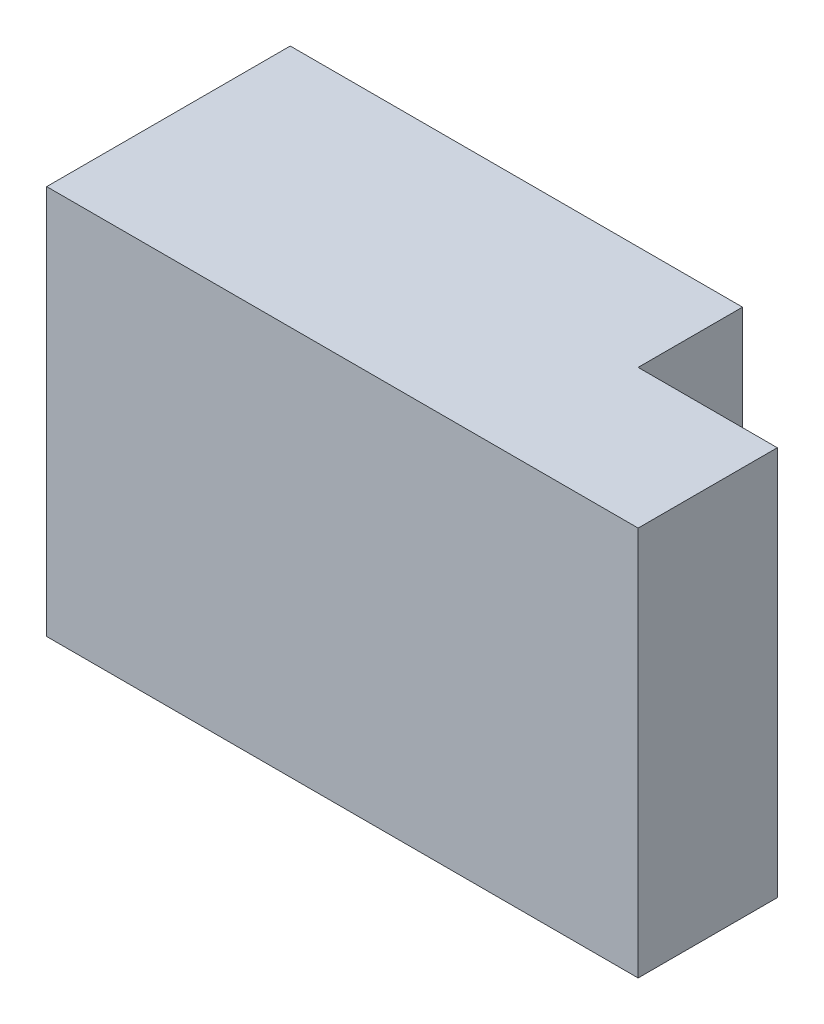
ISO-10303-21;
HEADER;
FILE_DESCRIPTION(('STEP AP214'),'2;1');
FILE_NAME('part.step','',(''),(''),'','','');
FILE_SCHEMA(('AUTOMOTIVE_DESIGN { 1 0 10303 214 1 1 1 1 }'));
ENDSEC;
DATA;
#1=APPLICATION_CONTEXT('core data for automotive mechanical design processes');
#2=APPLICATION_PROTOCOL_DEFINITION('international standard','automotive_design',2000,#1);
#3=PRODUCT_CONTEXT('',#1,'mechanical');
#4=PRODUCT('Part','Part','',(#3));
#5=PRODUCT_RELATED_PRODUCT_CATEGORY('part','',(#4));
#6=PRODUCT_DEFINITION_FORMATION('','',#4);
#7=PRODUCT_DEFINITION_CONTEXT('part definition',#1,'design');
#8=PRODUCT_DEFINITION('design','',#6,#7);
#9=PRODUCT_DEFINITION_SHAPE('','',#8);
#10=(LENGTH_UNIT() NAMED_UNIT(*) SI_UNIT(.MILLI.,.METRE.));
#11=(NAMED_UNIT(*) PLANE_ANGLE_UNIT() SI_UNIT($,.RADIAN.));
#12=(NAMED_UNIT(*) SI_UNIT($,.STERADIAN.) SOLID_ANGLE_UNIT());
#13=UNCERTAINTY_MEASURE_WITH_UNIT(LENGTH_MEASURE(1.E-05),#10,'distance_accuracy_value','');
#14=(GEOMETRIC_REPRESENTATION_CONTEXT(3) GLOBAL_UNCERTAINTY_ASSIGNED_CONTEXT((#13)) GLOBAL_UNIT_ASSIGNED_CONTEXT((#10,
#11,#12)) REPRESENTATION_CONTEXT('',''));
#15=CARTESIAN_POINT('',(0.,0.,0.));
#16=DIRECTION('',(0.,0.,1.));
#17=DIRECTION('',(1.,0.,0.));
#18=AXIS2_PLACEMENT_3D('',#15,#16,#17);
#19=CARTESIAN_POINT('',(0.,0.,0.));
#20=DIRECTION('',(0.,0.,1.));
#21=DIRECTION('',(1.,0.,0.));
#22=AXIS2_PLACEMENT_3D('',#19,#20,#21);
#23=PLANE('',#22);
#24=DIRECTION('',(0.,-1.,0.));
#25=VECTOR('',#24,1.);
#26=CARTESIAN_POINT('',(-32.5,-28.,0.));
#27=LINE('',#26,#25);
#28=CARTESIAN_POINT('',(-32.5,28.,0.));
#29=VERTEX_POINT('',#28);
#30=CARTESIAN_POINT('',(-32.5,-28.,0.));
#31=VERTEX_POINT('',#30);
#32=EDGE_CURVE('E100',#29,#31,#27,.T.);
#33=ORIENTED_EDGE('',*,*,#32,.F.);
#34=DIRECTION('',(-1.,0.,0.));
#35=VECTOR('',#34,1.);
#36=CARTESIAN_POINT('',(32.5,28.,0.));
#37=LINE('',#36,#35);
#38=CARTESIAN_POINT('',(32.5,28.,0.));
#39=VERTEX_POINT('',#38);
#40=EDGE_CURVE('E83',#39,#29,#37,.T.);
#41=ORIENTED_EDGE('',*,*,#40,.F.);
#42=DIRECTION('',(0.,1.,0.));
#43=VECTOR('',#42,1.);
#44=CARTESIAN_POINT('',(32.5,-28.,0.));
#45=LINE('',#44,#43);
#46=CARTESIAN_POINT('',(32.5,-28.,0.));
#47=VERTEX_POINT('',#46);
#48=EDGE_CURVE('E75',#47,#39,#45,.T.);
#49=ORIENTED_EDGE('',*,*,#48,.F.);
#50=DIRECTION('',(1.,0.,0.));
#51=VECTOR('',#50,1.);
#52=CARTESIAN_POINT('',(32.5,-28.,0.));
#53=LINE('',#52,#51);
#54=EDGE_CURVE('E84',#31,#47,#53,.T.);
#55=ORIENTED_EDGE('',*,*,#54,.F.);
#56=EDGE_LOOP('',(#33,#41,#49,#55));
#57=FACE_BOUND('',#56,.T.);
#58=CARTESIAN_POINT('',(-29.,24.5,0.));
#59=DIRECTION('',(0.,0.,1.));
#60=DIRECTION('',(1.,0.,0.));
#61=AXIS2_PLACEMENT_3D('',#58,#59,#60);
#62=CIRCLE('',#61,1.35000000000001);
#63=CARTESIAN_POINT('',(-27.65,24.5,0.));
#64=VERTEX_POINT('',#63);
#65=EDGE_CURVE('E177',#64,#64,#62,.T.);
#66=ORIENTED_EDGE('',*,*,#65,.T.);
#67=EDGE_LOOP('',(#66));
#68=FACE_BOUND('',#67,.T.);
#69=CARTESIAN_POINT('',(29.,24.5,0.));
#70=DIRECTION('',(0.,0.,1.));
#71=DIRECTION('',(-1.,0.,0.));
#72=AXIS2_PLACEMENT_3D('',#69,#70,#71);
#73=CIRCLE('',#72,1.35000000000001);
#74=CARTESIAN_POINT('',(27.65,24.5,0.));
#75=VERTEX_POINT('',#74);
#76=EDGE_CURVE('E170',#75,#75,#73,.T.);
#77=ORIENTED_EDGE('',*,*,#76,.T.);
#78=EDGE_LOOP('',(#77));
#79=FACE_BOUND('',#78,.T.);
#80=CARTESIAN_POINT('',(-29.,-24.5,0.));
#81=DIRECTION('',(0.,0.,1.));
#82=DIRECTION('',(-1.,0.,0.));
#83=AXIS2_PLACEMENT_3D('',#80,#81,#82);
#84=CIRCLE('',#83,1.35000000000001);
#85=CARTESIAN_POINT('',(-30.35,-24.5,0.));
#86=VERTEX_POINT('',#85);
#87=EDGE_CURVE('E161',#86,#86,#84,.T.);
#88=ORIENTED_EDGE('',*,*,#87,.T.);
#89=EDGE_LOOP('',(#88));
#90=FACE_BOUND('',#89,.T.);
#91=CARTESIAN_POINT('',(29.,-24.5,0.));
#92=DIRECTION('',(0.,0.,1.));
#93=DIRECTION('',(1.,0.,0.));
#94=AXIS2_PLACEMENT_3D('',#91,#92,#93);
#95=CIRCLE('',#94,1.35000000000001);
#96=CARTESIAN_POINT('',(30.35,-24.5,0.));
#97=VERTEX_POINT('',#96);
#98=EDGE_CURVE('E157',#97,#97,#95,.T.);
#99=ORIENTED_EDGE('',*,*,#98,.T.);
#100=EDGE_LOOP('',(#99));
#101=FACE_BOUND('',#100,.T.);
#102=ADVANCED_FACE('F43',(#57,#68,#79,#90,#101),#23,.F.);
#103=CARTESIAN_POINT('',(-32.5,-28.,15.));
#104=DIRECTION('',(1.,0.,0.));
#105=DIRECTION('',(0.,0.,-1.));
#106=AXIS2_PLACEMENT_3D('',#103,#104,#105);
#107=PLANE('',#106);
#108=ORIENTED_EDGE('',*,*,#32,.T.);
#109=DIRECTION('',(0.,0.,-1.));
#110=VECTOR('',#109,1.);
#111=CARTESIAN_POINT('',(-32.5,-28.,15.));
#112=LINE('',#111,#110);
#113=CARTESIAN_POINT('',(-32.5,-28.,35.));
#114=VERTEX_POINT('',#113);
#115=EDGE_CURVE('E11',#114,#31,#112,.T.);
#116=ORIENTED_EDGE('',*,*,#115,.F.);
#117=DIRECTION('',(0.,-1.,0.));
#118=VECTOR('',#117,1.);
#119=CARTESIAN_POINT('',(-32.5,28.,35.));
#120=LINE('',#119,#118);
#121=CARTESIAN_POINT('',(-32.5,28.,35.));
#122=VERTEX_POINT('',#121);
#123=EDGE_CURVE('E115',#122,#114,#120,.T.);
#124=ORIENTED_EDGE('',*,*,#123,.F.);
#125=DIRECTION('',(0.,0.,-1.));
#126=VECTOR('',#125,1.);
#127=CARTESIAN_POINT('',(-32.5,28.,15.));
#128=LINE('',#127,#126);
#129=EDGE_CURVE('E95',#122,#29,#128,.T.);
#130=ORIENTED_EDGE('',*,*,#129,.T.);
#131=EDGE_LOOP('',(#108,#116,#124,#130));
#132=FACE_BOUND('',#131,.T.);
#133=ADVANCED_FACE('F45',(#132),#107,.F.);
#134=CARTESIAN_POINT('',(32.5,-28.,15.));
#135=DIRECTION('',(0.,1.,0.));
#136=DIRECTION('',(-1.,0.,0.));
#137=AXIS2_PLACEMENT_3D('',#134,#135,#136);
#138=PLANE('',#137);
#139=ORIENTED_EDGE('',*,*,#54,.T.);
#140=DIRECTION('',(0.,0.,-1.));
#141=VECTOR('',#140,1.);
#142=CARTESIAN_POINT('',(32.5,-28.,15.));
#143=LINE('',#142,#141);
#144=CARTESIAN_POINT('',(32.5,-28.,15.));
#145=VERTEX_POINT('',#144);
#146=EDGE_CURVE('E53',#145,#47,#143,.T.);
#147=ORIENTED_EDGE('',*,*,#146,.F.);
#148=DIRECTION('',(1.,0.,0.));
#149=VECTOR('',#148,1.);
#150=CARTESIAN_POINT('',(-32.5,-28.,15.));
#151=LINE('',#150,#149);
#152=CARTESIAN_POINT('',(52.5,-28.,15.));
#153=VERTEX_POINT('',#152);
#154=EDGE_CURVE('E140',#145,#153,#151,.T.);
#155=ORIENTED_EDGE('',*,*,#154,.T.);
#156=DIRECTION('',(0.,0.,-1.));
#157=VECTOR('',#156,1.);
#158=CARTESIAN_POINT('',(52.5,-28.,35.));
#159=LINE('',#158,#157);
#160=CARTESIAN_POINT('',(52.5,-28.,35.));
#161=VERTEX_POINT('',#160);
#162=EDGE_CURVE('E134',#161,#153,#159,.T.);
#163=ORIENTED_EDGE('',*,*,#162,.F.);
#164=DIRECTION('',(1.,0.,0.));
#165=VECTOR('',#164,1.);
#166=CARTESIAN_POINT('',(-32.5,-28.,35.));
#167=LINE('',#166,#165);
#168=EDGE_CURVE('E136',#114,#161,#167,.T.);
#169=ORIENTED_EDGE('',*,*,#168,.F.);
#170=ORIENTED_EDGE('',*,*,#115,.T.);
#171=EDGE_LOOP('',(#139,#147,#155,#163,#169,#170));
#172=FACE_BOUND('',#171,.T.);
#173=ADVANCED_FACE('F186',(#172),#138,.F.);
#174=CARTESIAN_POINT('',(32.5,-28.,15.));
#175=DIRECTION('',(-1.,0.,0.));
#176=DIRECTION('',(0.,0.,1.));
#177=AXIS2_PLACEMENT_3D('',#174,#175,#176);
#178=PLANE('',#177);
#179=ORIENTED_EDGE('',*,*,#48,.T.);
#180=DIRECTION('',(0.,0.,-1.));
#181=VECTOR('',#180,1.);
#182=CARTESIAN_POINT('',(32.5,28.,15.));
#183=LINE('',#182,#181);
#184=CARTESIAN_POINT('',(32.5,28.,15.));
#185=VERTEX_POINT('',#184);
#186=EDGE_CURVE('E78',#185,#39,#183,.T.);
#187=ORIENTED_EDGE('',*,*,#186,.F.);
#188=DIRECTION('',(0.,1.,0.));
#189=VECTOR('',#188,1.);
#190=CARTESIAN_POINT('',(32.5,-28.,15.));
#191=LINE('',#190,#189);
#192=EDGE_CURVE('E102',#145,#185,#191,.T.);
#193=ORIENTED_EDGE('',*,*,#192,.F.);
#194=ORIENTED_EDGE('',*,*,#146,.T.);
#195=EDGE_LOOP('',(#179,#187,#193,#194));
#196=FACE_BOUND('',#195,.T.);
#197=ADVANCED_FACE('F77',(#196),#178,.F.);
#198=CARTESIAN_POINT('',(32.5,28.,15.));
#199=DIRECTION('',(0.,-1.,0.));
#200=DIRECTION('',(1.,0.,0.));
#201=AXIS2_PLACEMENT_3D('',#198,#199,#200);
#202=PLANE('',#201);
#203=ORIENTED_EDGE('',*,*,#40,.T.);
#204=ORIENTED_EDGE('',*,*,#129,.F.);
#205=DIRECTION('',(-1.,0.,0.));
#206=VECTOR('',#205,1.);
#207=CARTESIAN_POINT('',(-32.5,28.,35.));
#208=LINE('',#207,#206);
#209=CARTESIAN_POINT('',(52.5,28.,35.));
#210=VERTEX_POINT('',#209);
#211=EDGE_CURVE('E119',#210,#122,#208,.T.);
#212=ORIENTED_EDGE('',*,*,#211,.F.);
#213=DIRECTION('',(0.,0.,-1.));
#214=VECTOR('',#213,1.);
#215=CARTESIAN_POINT('',(52.5,28.,35.));
#216=LINE('',#215,#214);
#217=CARTESIAN_POINT('',(52.5,28.,15.));
#218=VERTEX_POINT('',#217);
#219=EDGE_CURVE('E130',#210,#218,#216,.T.);
#220=ORIENTED_EDGE('',*,*,#219,.T.);
#221=DIRECTION('',(-1.,0.,0.));
#222=VECTOR('',#221,1.);
#223=CARTESIAN_POINT('',(-32.5,28.,15.));
#224=LINE('',#223,#222);
#225=EDGE_CURVE('E93',#218,#185,#224,.T.);
#226=ORIENTED_EDGE('',*,*,#225,.T.);
#227=ORIENTED_EDGE('',*,*,#186,.T.);
#228=EDGE_LOOP('',(#203,#204,#212,#220,#226,#227));
#229=FACE_BOUND('',#228,.T.);
#230=ADVANCED_FACE('F88',(#229),#202,.F.);
#231=CARTESIAN_POINT('',(-29.,24.5,15.));
#232=DIRECTION('',(0.,0.,-1.));
#233=DIRECTION('',(-1.,0.,0.));
#234=AXIS2_PLACEMENT_3D('',#231,#232,#233);
#235=CYLINDRICAL_SURFACE('',#234,1.35000000000001);
#236=CARTESIAN_POINT('',(-29.,24.5,15.));
#237=DIRECTION('',(0.,0.,1.));
#238=DIRECTION('',(1.,0.,0.));
#239=AXIS2_PLACEMENT_3D('',#236,#237,#238);
#240=CIRCLE('',#239,1.35000000000001);
#241=CARTESIAN_POINT('',(-27.65,24.5,15.));
#242=VERTEX_POINT('',#241);
#243=EDGE_CURVE('E166',#242,#242,#240,.T.);
#244=ORIENTED_EDGE('',*,*,#243,.T.);
#245=EDGE_LOOP('',(#244));
#246=FACE_BOUND('',#245,.T.);
#247=ORIENTED_EDGE('',*,*,#65,.F.);
#248=EDGE_LOOP('',(#247));
#249=FACE_BOUND('',#248,.T.);
#250=ADVANCED_FACE('F227',(#246,#249),#235,.F.);
#251=CARTESIAN_POINT('',(29.,24.5,15.));
#252=DIRECTION('',(0.,0.,-1.));
#253=DIRECTION('',(-1.,0.,0.));
#254=AXIS2_PLACEMENT_3D('',#251,#252,#253);
#255=CYLINDRICAL_SURFACE('',#254,1.35000000000001);
#256=CARTESIAN_POINT('',(29.,24.5,15.));
#257=DIRECTION('',(0.,0.,1.));
#258=DIRECTION('',(-1.,0.,0.));
#259=AXIS2_PLACEMENT_3D('',#256,#257,#258);
#260=CIRCLE('',#259,1.35000000000001);
#261=CARTESIAN_POINT('',(27.65,24.5,15.));
#262=VERTEX_POINT('',#261);
#263=EDGE_CURVE('E156',#262,#262,#260,.T.);
#264=ORIENTED_EDGE('',*,*,#263,.T.);
#265=EDGE_LOOP('',(#264));
#266=FACE_BOUND('',#265,.T.);
#267=ORIENTED_EDGE('',*,*,#76,.F.);
#268=EDGE_LOOP('',(#267));
#269=FACE_BOUND('',#268,.T.);
#270=ADVANCED_FACE('F252',(#266,#269),#255,.F.);
#271=CARTESIAN_POINT('',(-29.,-24.5,15.));
#272=DIRECTION('',(0.,0.,-1.));
#273=DIRECTION('',(-1.,0.,0.));
#274=AXIS2_PLACEMENT_3D('',#271,#272,#273);
#275=CYLINDRICAL_SURFACE('',#274,1.35000000000001);
#276=CARTESIAN_POINT('',(-29.,-24.5,15.));
#277=DIRECTION('',(0.,0.,1.));
#278=DIRECTION('',(-1.,0.,0.));
#279=AXIS2_PLACEMENT_3D('',#276,#277,#278);
#280=CIRCLE('',#279,1.35000000000001);
#281=CARTESIAN_POINT('',(-30.35,-24.5,15.));
#282=VERTEX_POINT('',#281);
#283=EDGE_CURVE('E162',#282,#282,#280,.T.);
#284=ORIENTED_EDGE('',*,*,#283,.T.);
#285=EDGE_LOOP('',(#284));
#286=FACE_BOUND('',#285,.T.);
#287=ORIENTED_EDGE('',*,*,#87,.F.);
#288=EDGE_LOOP('',(#287));
#289=FACE_BOUND('',#288,.T.);
#290=ADVANCED_FACE('F259',(#286,#289),#275,.F.);
#291=CARTESIAN_POINT('',(29.,-24.5,15.));
#292=DIRECTION('',(0.,0.,-1.));
#293=DIRECTION('',(-1.,0.,0.));
#294=AXIS2_PLACEMENT_3D('',#291,#292,#293);
#295=CYLINDRICAL_SURFACE('',#294,1.35000000000001);
#296=CARTESIAN_POINT('',(29.,-24.5,15.));
#297=DIRECTION('',(0.,0.,1.));
#298=DIRECTION('',(1.,0.,0.));
#299=AXIS2_PLACEMENT_3D('',#296,#297,#298);
#300=CIRCLE('',#299,1.35000000000001);
#301=CARTESIAN_POINT('',(30.35,-24.5,15.));
#302=VERTEX_POINT('',#301);
#303=EDGE_CURVE('E152',#302,#302,#300,.T.);
#304=ORIENTED_EDGE('',*,*,#303,.T.);
#305=EDGE_LOOP('',(#304));
#306=FACE_BOUND('',#305,.T.);
#307=ORIENTED_EDGE('',*,*,#98,.F.);
#308=EDGE_LOOP('',(#307));
#309=FACE_BOUND('',#308,.T.);
#310=ADVANCED_FACE('F218',(#306,#309),#295,.F.);
#311=CARTESIAN_POINT('',(0.,0.,15.));
#312=DIRECTION('',(0.,0.,1.));
#313=DIRECTION('',(1.,0.,0.));
#314=AXIS2_PLACEMENT_3D('',#311,#312,#313);
#315=PLANE('',#314);
#316=ORIENTED_EDGE('',*,*,#303,.F.);
#317=EDGE_LOOP('',(#316));
#318=FACE_BOUND('',#317,.T.);
#319=ADVANCED_FACE('F206',(#318),#315,.F.);
#320=ORIENTED_EDGE('',*,*,#263,.F.);
#321=EDGE_LOOP('',(#320));
#322=FACE_BOUND('',#321,.T.);
#323=ADVANCED_FACE('F203',(#322),#315,.F.);
#324=ORIENTED_EDGE('',*,*,#154,.F.);
#325=ORIENTED_EDGE('',*,*,#192,.T.);
#326=ORIENTED_EDGE('',*,*,#225,.F.);
#327=DIRECTION('',(0.,1.,0.));
#328=VECTOR('',#327,1.);
#329=CARTESIAN_POINT('',(52.5,28.,15.));
#330=LINE('',#329,#328);
#331=EDGE_CURVE('E143',#153,#218,#330,.T.);
#332=ORIENTED_EDGE('',*,*,#331,.F.);
#333=EDGE_LOOP('',(#324,#325,#326,#332));
#334=FACE_BOUND('',#333,.T.);
#335=ADVANCED_FACE('F201',(#334),#315,.F.);
#336=CARTESIAN_POINT('',(0.,0.,35.));
#337=DIRECTION('',(0.,0.,1.));
#338=DIRECTION('',(1.,0.,0.));
#339=AXIS2_PLACEMENT_3D('',#336,#337,#338);
#340=PLANE('',#339);
#341=ORIENTED_EDGE('',*,*,#123,.T.);
#342=ORIENTED_EDGE('',*,*,#168,.T.);
#343=DIRECTION('',(0.,1.,0.));
#344=VECTOR('',#343,1.);
#345=CARTESIAN_POINT('',(52.5,28.,35.));
#346=LINE('',#345,#344);
#347=EDGE_CURVE('E127',#161,#210,#346,.T.);
#348=ORIENTED_EDGE('',*,*,#347,.T.);
#349=ORIENTED_EDGE('',*,*,#211,.T.);
#350=EDGE_LOOP('',(#341,#342,#348,#349));
#351=FACE_BOUND('',#350,.T.);
#352=ADVANCED_FACE('F123',(#351),#340,.T.);
#353=CARTESIAN_POINT('',(52.5,28.,35.));
#354=DIRECTION('',(-1.,0.,0.));
#355=DIRECTION('',(0.,0.,1.));
#356=AXIS2_PLACEMENT_3D('',#353,#354,#355);
#357=PLANE('',#356);
#358=ORIENTED_EDGE('',*,*,#331,.T.);
#359=ORIENTED_EDGE('',*,*,#219,.F.);
#360=ORIENTED_EDGE('',*,*,#347,.F.);
#361=ORIENTED_EDGE('',*,*,#162,.T.);
#362=EDGE_LOOP('',(#358,#359,#360,#361));
#363=FACE_BOUND('',#362,.T.);
#364=ADVANCED_FACE('F200',(#363),#357,.F.);
#365=ORIENTED_EDGE('',*,*,#243,.F.);
#366=EDGE_LOOP('',(#365));
#367=FACE_BOUND('',#366,.T.);
#368=ADVANCED_FACE('F213',(#367),#315,.F.);
#369=ORIENTED_EDGE('',*,*,#283,.F.);
#370=EDGE_LOOP('',(#369));
#371=FACE_BOUND('',#370,.T.);
#372=ADVANCED_FACE('F205',(#371),#315,.F.);
#373=CLOSED_SHELL('',(#102,#133,#173,#197,#230,#250,#270,#290,#310,#319,#323,#335,#352,#364,
#368,#372));
#374=MANIFOLD_SOLID_BREP('B2',#373);
#375=ADVANCED_BREP_SHAPE_REPRESENTATION('',(#18,#374),#14);
#376=SHAPE_DEFINITION_REPRESENTATION(#9,#375);
ENDSEC;
END-ISO-10303-21;
